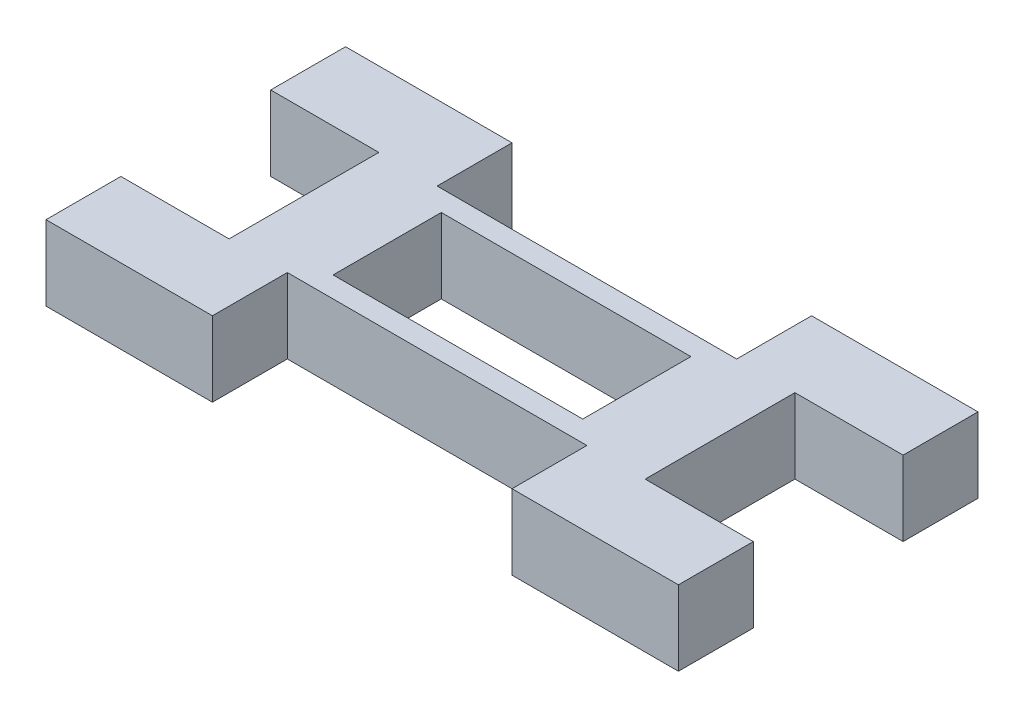
ISO-10303-21;
HEADER;
FILE_DESCRIPTION(('STEP AP214'),'2;1');
FILE_NAME('part.step','',(''),(''),'','','');
FILE_SCHEMA(('AUTOMOTIVE_DESIGN { 1 0 10303 214 1 1 1 1 }'));
ENDSEC;
DATA;
#1=APPLICATION_CONTEXT('core data for automotive mechanical design processes');
#2=APPLICATION_PROTOCOL_DEFINITION('international standard','automotive_design',2000,#1);
#3=PRODUCT_CONTEXT('',#1,'mechanical');
#4=PRODUCT('Part','Part','',(#3));
#5=PRODUCT_RELATED_PRODUCT_CATEGORY('part','',(#4));
#6=PRODUCT_DEFINITION_FORMATION('','',#4);
#7=PRODUCT_DEFINITION_CONTEXT('part definition',#1,'design');
#8=PRODUCT_DEFINITION('design','',#6,#7);
#9=PRODUCT_DEFINITION_SHAPE('','',#8);
#10=(LENGTH_UNIT() NAMED_UNIT(*) SI_UNIT(.MILLI.,.METRE.));
#11=(NAMED_UNIT(*) PLANE_ANGLE_UNIT() SI_UNIT($,.RADIAN.));
#12=(NAMED_UNIT(*) SI_UNIT($,.STERADIAN.) SOLID_ANGLE_UNIT());
#13=UNCERTAINTY_MEASURE_WITH_UNIT(LENGTH_MEASURE(1.E-05),#10,'distance_accuracy_value','');
#14=(GEOMETRIC_REPRESENTATION_CONTEXT(3) GLOBAL_UNCERTAINTY_ASSIGNED_CONTEXT((#13)) GLOBAL_UNIT_ASSIGNED_CONTEXT((#10,
#11,#12)) REPRESENTATION_CONTEXT('',''));
#15=CARTESIAN_POINT('',(0.,0.,0.));
#16=DIRECTION('',(0.,0.,1.));
#17=DIRECTION('',(1.,0.,0.));
#18=AXIS2_PLACEMENT_3D('',#15,#16,#17);
#19=CARTESIAN_POINT('',(-27.5,4.5,-4.5));
#20=DIRECTION('',(0.,0.,1.));
#21=DIRECTION('',(1.,0.,0.));
#22=AXIS2_PLACEMENT_3D('',#19,#20,#21);
#23=PLANE('',#22);
#24=DIRECTION('',(-1.,0.,0.));
#25=VECTOR('',#24,1.);
#26=CARTESIAN_POINT('',(-27.5,0.,-4.5));
#27=LINE('',#26,#25);
#28=CARTESIAN_POINT('',(9.00000000000002,0.,-4.5));
#29=VERTEX_POINT('',#28);
#30=CARTESIAN_POINT('',(-9.00000000000002,0.,-4.5));
#31=VERTEX_POINT('',#30);
#32=EDGE_CURVE('E360',#29,#31,#27,.T.);
#33=ORIENTED_EDGE('',*,*,#32,.T.);
#34=DIRECTION('',(0.,1.,0.));
#35=VECTOR('',#34,1.);
#36=CARTESIAN_POINT('',(-9.00000000000002,0.,-4.5));
#37=LINE('',#36,#35);
#38=CARTESIAN_POINT('',(-9.00000000000002,4.5,-4.5));
#39=VERTEX_POINT('',#38);
#40=EDGE_CURVE('E281',#31,#39,#37,.T.);
#41=ORIENTED_EDGE('',*,*,#40,.T.);
#42=DIRECTION('',(-1.,0.,0.));
#43=VECTOR('',#42,1.);
#44=CARTESIAN_POINT('',(-27.5,4.5,-4.5));
#45=LINE('',#44,#43);
#46=CARTESIAN_POINT('',(9.00000000000002,4.5,-4.5));
#47=VERTEX_POINT('',#46);
#48=EDGE_CURVE('E381',#47,#39,#45,.T.);
#49=ORIENTED_EDGE('',*,*,#48,.F.);
#50=DIRECTION('',(0.,1.,0.));
#51=VECTOR('',#50,1.);
#52=CARTESIAN_POINT('',(9.00000000000002,0.,-4.5));
#53=LINE('',#52,#51);
#54=EDGE_CURVE('E304',#29,#47,#53,.T.);
#55=ORIENTED_EDGE('',*,*,#54,.F.);
#56=EDGE_LOOP('',(#33,#41,#49,#55));
#57=FACE_BOUND('',#56,.T.);
#58=ADVANCED_FACE('F33',(#57),#23,.F.);
#59=CARTESIAN_POINT('',(-27.5,4.5,4.5));
#60=DIRECTION('',(0.,0.,-1.));
#61=DIRECTION('',(-1.,0.,0.));
#62=AXIS2_PLACEMENT_3D('',#59,#60,#61);
#63=PLANE('',#62);
#64=DIRECTION('',(1.,0.,0.));
#65=VECTOR('',#64,1.);
#66=CARTESIAN_POINT('',(-27.5,0.,4.5));
#67=LINE('',#66,#65);
#68=CARTESIAN_POINT('',(-9.00000000000002,0.,4.5));
#69=VERTEX_POINT('',#68);
#70=CARTESIAN_POINT('',(9.00000000000003,0.,4.5));
#71=VERTEX_POINT('',#70);
#72=EDGE_CURVE('E366',#69,#71,#67,.T.);
#73=ORIENTED_EDGE('',*,*,#72,.T.);
#74=DIRECTION('',(0.,1.,0.));
#75=VECTOR('',#74,1.);
#76=CARTESIAN_POINT('',(9.00000000000002,0.,4.5));
#77=LINE('',#76,#75);
#78=CARTESIAN_POINT('',(9.00000000000003,4.5,4.5));
#79=VERTEX_POINT('',#78);
#80=EDGE_CURVE('E405',#71,#79,#77,.T.);
#81=ORIENTED_EDGE('',*,*,#80,.T.);
#82=DIRECTION('',(1.,0.,0.));
#83=VECTOR('',#82,1.);
#84=CARTESIAN_POINT('',(-27.5,4.5,4.5));
#85=LINE('',#84,#83);
#86=CARTESIAN_POINT('',(-9.00000000000002,4.5,4.5));
#87=VERTEX_POINT('',#86);
#88=EDGE_CURVE('E321',#87,#79,#85,.T.);
#89=ORIENTED_EDGE('',*,*,#88,.F.);
#90=DIRECTION('',(0.,1.,0.));
#91=VECTOR('',#90,1.);
#92=CARTESIAN_POINT('',(-9.00000000000002,0.,4.5));
#93=LINE('',#92,#91);
#94=EDGE_CURVE('E367',#69,#87,#93,.T.);
#95=ORIENTED_EDGE('',*,*,#94,.F.);
#96=EDGE_LOOP('',(#73,#81,#89,#95));
#97=FACE_BOUND('',#96,.T.);
#98=ADVANCED_FACE('F352',(#97),#63,.F.);
#99=CARTESIAN_POINT('',(0.,4.5,0.));
#100=DIRECTION('',(0.,-1.,0.));
#101=DIRECTION('',(0.,0.,-1.));
#102=AXIS2_PLACEMENT_3D('',#99,#100,#101);
#103=PLANE('',#102);
#104=DIRECTION('',(1.,0.,0.));
#105=VECTOR('',#104,1.);
#106=CARTESIAN_POINT('',(0.,4.5,-3.25));
#107=LINE('',#106,#105);
#108=CARTESIAN_POINT('',(-7.49999999999993,4.5,-3.25));
#109=VERTEX_POINT('',#108);
#110=CARTESIAN_POINT('',(7.49999999999998,4.5,-3.25));
#111=VERTEX_POINT('',#110);
#112=EDGE_CURVE('E189',#109,#111,#107,.T.);
#113=ORIENTED_EDGE('',*,*,#112,.T.);
#114=DIRECTION('',(0.,0.,1.));
#115=VECTOR('',#114,1.);
#116=CARTESIAN_POINT('',(7.49999999999998,4.5,0.));
#117=LINE('',#116,#115);
#118=CARTESIAN_POINT('',(7.49999999999998,4.5,3.25));
#119=VERTEX_POINT('',#118);
#120=EDGE_CURVE('E211',#111,#119,#117,.T.);
#121=ORIENTED_EDGE('',*,*,#120,.T.);
#122=DIRECTION('',(-1.,0.,0.));
#123=VECTOR('',#122,1.);
#124=CARTESIAN_POINT('',(0.,4.5,3.25));
#125=LINE('',#124,#123);
#126=CARTESIAN_POINT('',(-7.49999999999993,4.5,3.25));
#127=VERTEX_POINT('',#126);
#128=EDGE_CURVE('E209',#119,#127,#125,.T.);
#129=ORIENTED_EDGE('',*,*,#128,.T.);
#130=DIRECTION('',(0.,0.,-1.));
#131=VECTOR('',#130,1.);
#132=CARTESIAN_POINT('',(-7.49999999999993,4.5,0.));
#133=LINE('',#132,#131);
#134=EDGE_CURVE('E194',#127,#109,#133,.T.);
#135=ORIENTED_EDGE('',*,*,#134,.T.);
#136=EDGE_LOOP('',(#113,#121,#129,#135));
#137=FACE_BOUND('',#136,.T.);
#138=DIRECTION('',(0.,0.,-1.));
#139=VECTOR('',#138,1.);
#140=CARTESIAN_POINT('',(19.,4.5,4.5));
#141=LINE('',#140,#139);
#142=CARTESIAN_POINT('',(19.,4.5,8.99999999999999));
#143=VERTEX_POINT('',#142);
#144=CARTESIAN_POINT('',(19.,4.5,4.5));
#145=VERTEX_POINT('',#144);
#146=EDGE_CURVE('E460',#143,#145,#141,.T.);
#147=ORIENTED_EDGE('',*,*,#146,.T.);
#148=DIRECTION('',(-1.,0.,0.));
#149=VECTOR('',#148,1.);
#150=CARTESIAN_POINT('',(0.,4.5,4.5));
#151=LINE('',#150,#149);
#152=CARTESIAN_POINT('',(12.5,4.5,4.5));
#153=VERTEX_POINT('',#152);
#154=EDGE_CURVE('E233',#145,#153,#151,.T.);
#155=ORIENTED_EDGE('',*,*,#154,.T.);
#156=DIRECTION('',(0.,0.,-1.));
#157=VECTOR('',#156,1.);
#158=CARTESIAN_POINT('',(12.5,4.5,0.));
#159=LINE('',#158,#157);
#160=CARTESIAN_POINT('',(12.5,4.5,-4.5));
#161=VERTEX_POINT('',#160);
#162=EDGE_CURVE('E236',#153,#161,#159,.T.);
#163=ORIENTED_EDGE('',*,*,#162,.T.);
#164=DIRECTION('',(1.,0.,0.));
#165=VECTOR('',#164,1.);
#166=CARTESIAN_POINT('',(0.,4.5,-4.5));
#167=LINE('',#166,#165);
#168=CARTESIAN_POINT('',(19.,4.5,-4.5));
#169=VERTEX_POINT('',#168);
#170=EDGE_CURVE('E228',#161,#169,#167,.T.);
#171=ORIENTED_EDGE('',*,*,#170,.T.);
#172=DIRECTION('',(0.,0.,-1.));
#173=VECTOR('',#172,1.);
#174=CARTESIAN_POINT('',(19.,4.5,-4.5));
#175=LINE('',#174,#173);
#176=CARTESIAN_POINT('',(19.,4.5,-8.99999999999999));
#177=VERTEX_POINT('',#176);
#178=EDGE_CURVE('E283',#169,#177,#175,.T.);
#179=ORIENTED_EDGE('',*,*,#178,.T.);
#180=DIRECTION('',(-1.,0.,0.));
#181=VECTOR('',#180,1.);
#182=CARTESIAN_POINT('',(19.,4.5,-8.99999999999999));
#183=LINE('',#182,#181);
#184=CARTESIAN_POINT('',(9.,4.5,-8.99999999999999));
#185=VERTEX_POINT('',#184);
#186=EDGE_CURVE('E295',#177,#185,#183,.T.);
#187=ORIENTED_EDGE('',*,*,#186,.T.);
#188=DIRECTION('',(0.,0.,1.));
#189=VECTOR('',#188,1.);
#190=CARTESIAN_POINT('',(9.,4.5,-8.99999999999999));
#191=LINE('',#190,#189);
#192=EDGE_CURVE('E298',#185,#47,#191,.T.);
#193=ORIENTED_EDGE('',*,*,#192,.T.);
#194=ORIENTED_EDGE('',*,*,#48,.T.);
#195=DIRECTION('',(0.,0.,-1.));
#196=VECTOR('',#195,1.);
#197=CARTESIAN_POINT('',(-9.,4.5,-8.99999999999999));
#198=LINE('',#197,#196);
#199=CARTESIAN_POINT('',(-9.,4.5,-8.99999999999999));
#200=VERTEX_POINT('',#199);
#201=EDGE_CURVE('E262',#39,#200,#198,.T.);
#202=ORIENTED_EDGE('',*,*,#201,.T.);
#203=DIRECTION('',(-1.,0.,0.));
#204=VECTOR('',#203,1.);
#205=CARTESIAN_POINT('',(-19.,4.5,-8.99999999999999));
#206=LINE('',#205,#204);
#207=CARTESIAN_POINT('',(-19.,4.5,-8.99999999999999));
#208=VERTEX_POINT('',#207);
#209=EDGE_CURVE('E276',#200,#208,#206,.T.);
#210=ORIENTED_EDGE('',*,*,#209,.T.);
#211=DIRECTION('',(0.,0.,1.));
#212=VECTOR('',#211,1.);
#213=CARTESIAN_POINT('',(-19.,4.5,-4.5));
#214=LINE('',#213,#212);
#215=CARTESIAN_POINT('',(-19.,4.5,-4.5));
#216=VERTEX_POINT('',#215);
#217=EDGE_CURVE('E267',#208,#216,#214,.T.);
#218=ORIENTED_EDGE('',*,*,#217,.T.);
#219=DIRECTION('',(1.,0.,0.));
#220=VECTOR('',#219,1.);
#221=CARTESIAN_POINT('',(0.,4.5,-4.5));
#222=LINE('',#221,#220);
#223=CARTESIAN_POINT('',(-12.5,4.5,-4.5));
#224=VERTEX_POINT('',#223);
#225=EDGE_CURVE('E247',#216,#224,#222,.T.);
#226=ORIENTED_EDGE('',*,*,#225,.T.);
#227=DIRECTION('',(0.,0.,1.));
#228=VECTOR('',#227,1.);
#229=CARTESIAN_POINT('',(-12.5,4.5,0.));
#230=LINE('',#229,#228);
#231=CARTESIAN_POINT('',(-12.5,4.5,4.5));
#232=VERTEX_POINT('',#231);
#233=EDGE_CURVE('E259',#224,#232,#230,.T.);
#234=ORIENTED_EDGE('',*,*,#233,.T.);
#235=DIRECTION('',(-1.,0.,0.));
#236=VECTOR('',#235,1.);
#237=CARTESIAN_POINT('',(0.,4.5,4.5));
#238=LINE('',#237,#236);
#239=CARTESIAN_POINT('',(-19.,4.5,4.5));
#240=VERTEX_POINT('',#239);
#241=EDGE_CURVE('E256',#232,#240,#238,.T.);
#242=ORIENTED_EDGE('',*,*,#241,.T.);
#243=DIRECTION('',(0.,0.,1.));
#244=VECTOR('',#243,1.);
#245=CARTESIAN_POINT('',(-19.,4.5,4.5));
#246=LINE('',#245,#244);
#247=CARTESIAN_POINT('',(-19.,4.5,9.));
#248=VERTEX_POINT('',#247);
#249=EDGE_CURVE('E401',#240,#248,#246,.T.);
#250=ORIENTED_EDGE('',*,*,#249,.T.);
#251=DIRECTION('',(1.,0.,0.));
#252=VECTOR('',#251,1.);
#253=CARTESIAN_POINT('',(-19.,4.5,9.));
#254=LINE('',#253,#252);
#255=CARTESIAN_POINT('',(-9.,4.5,9.));
#256=VERTEX_POINT('',#255);
#257=EDGE_CURVE('E404',#248,#256,#254,.T.);
#258=ORIENTED_EDGE('',*,*,#257,.T.);
#259=DIRECTION('',(0.,0.,-1.));
#260=VECTOR('',#259,1.);
#261=CARTESIAN_POINT('',(-9.,4.5,9.));
#262=LINE('',#261,#260);
#263=EDGE_CURVE('E416',#256,#87,#262,.T.);
#264=ORIENTED_EDGE('',*,*,#263,.T.);
#265=ORIENTED_EDGE('',*,*,#88,.T.);
#266=DIRECTION('',(0.,0.,1.));
#267=VECTOR('',#266,1.);
#268=CARTESIAN_POINT('',(9.,4.5,8.99999999999999));
#269=LINE('',#268,#267);
#270=CARTESIAN_POINT('',(9.,4.5,8.99999999999999));
#271=VERTEX_POINT('',#270);
#272=EDGE_CURVE('E307',#79,#271,#269,.T.);
#273=ORIENTED_EDGE('',*,*,#272,.T.);
#274=DIRECTION('',(1.,0.,0.));
#275=VECTOR('',#274,1.);
#276=CARTESIAN_POINT('',(19.,4.5,8.99999999999999));
#277=LINE('',#276,#275);
#278=EDGE_CURVE('E463',#271,#143,#277,.T.);
#279=ORIENTED_EDGE('',*,*,#278,.T.);
#280=EDGE_LOOP('',(#147,#155,#163,#171,#179,#187,#193,#194,#202,#210,#218,#226,#234,#242,#250,
#258,#264,#265,#273,#279));
#281=FACE_BOUND('',#280,.T.);
#282=ADVANCED_FACE('F207',(#137,#281),#103,.F.);
#283=CARTESIAN_POINT('',(0.,0.,0.));
#284=DIRECTION('',(0.,-1.,0.));
#285=DIRECTION('',(0.,0.,-1.));
#286=AXIS2_PLACEMENT_3D('',#283,#284,#285);
#287=PLANE('',#286);
#288=DIRECTION('',(0.,0.,1.));
#289=VECTOR('',#288,1.);
#290=CARTESIAN_POINT('',(7.49999999999998,0.,0.));
#291=LINE('',#290,#289);
#292=CARTESIAN_POINT('',(7.49999999999998,0.,-3.25));
#293=VERTEX_POINT('',#292);
#294=CARTESIAN_POINT('',(7.49999999999998,0.,3.25));
#295=VERTEX_POINT('',#294);
#296=EDGE_CURVE('E11',#293,#295,#291,.T.);
#297=ORIENTED_EDGE('',*,*,#296,.F.);
#298=DIRECTION('',(1.,0.,0.));
#299=VECTOR('',#298,1.);
#300=CARTESIAN_POINT('',(0.,0.,-3.25));
#301=LINE('',#300,#299);
#302=CARTESIAN_POINT('',(-7.49999999999993,0.,-3.25));
#303=VERTEX_POINT('',#302);
#304=EDGE_CURVE('E323',#303,#293,#301,.T.);
#305=ORIENTED_EDGE('',*,*,#304,.F.);
#306=DIRECTION('',(0.,0.,-1.));
#307=VECTOR('',#306,1.);
#308=CARTESIAN_POINT('',(-7.49999999999993,0.,0.));
#309=LINE('',#308,#307);
#310=CARTESIAN_POINT('',(-7.49999999999993,0.,3.25));
#311=VERTEX_POINT('',#310);
#312=EDGE_CURVE('E202',#311,#303,#309,.T.);
#313=ORIENTED_EDGE('',*,*,#312,.F.);
#314=DIRECTION('',(-1.,0.,0.));
#315=VECTOR('',#314,1.);
#316=CARTESIAN_POINT('',(0.,0.,3.25));
#317=LINE('',#316,#315);
#318=EDGE_CURVE('E40',#295,#311,#317,.T.);
#319=ORIENTED_EDGE('',*,*,#318,.F.);
#320=EDGE_LOOP('',(#297,#305,#313,#319));
#321=FACE_BOUND('',#320,.T.);
#322=DIRECTION('',(-1.,0.,0.));
#323=VECTOR('',#322,1.);
#324=CARTESIAN_POINT('',(0.,0.,4.5));
#325=LINE('',#324,#323);
#326=CARTESIAN_POINT('',(19.,0.,4.5));
#327=VERTEX_POINT('',#326);
#328=CARTESIAN_POINT('',(12.5,0.,4.5));
#329=VERTEX_POINT('',#328);
#330=EDGE_CURVE('E231',#327,#329,#325,.T.);
#331=ORIENTED_EDGE('',*,*,#330,.F.);
#332=DIRECTION('',(0.,0.,-1.));
#333=VECTOR('',#332,1.);
#334=CARTESIAN_POINT('',(19.,0.,4.5));
#335=LINE('',#334,#333);
#336=CARTESIAN_POINT('',(19.,0.,8.99999999999999));
#337=VERTEX_POINT('',#336);
#338=EDGE_CURVE('E454',#337,#327,#335,.T.);
#339=ORIENTED_EDGE('',*,*,#338,.F.);
#340=DIRECTION('',(1.,0.,0.));
#341=VECTOR('',#340,1.);
#342=CARTESIAN_POINT('',(19.,0.,8.99999999999999));
#343=LINE('',#342,#341);
#344=CARTESIAN_POINT('',(9.,0.,8.99999999999999));
#345=VERTEX_POINT('',#344);
#346=EDGE_CURVE('E470',#345,#337,#343,.T.);
#347=ORIENTED_EDGE('',*,*,#346,.F.);
#348=DIRECTION('',(0.,0.,1.));
#349=VECTOR('',#348,1.);
#350=CARTESIAN_POINT('',(9.,0.,8.99999999999999));
#351=LINE('',#350,#349);
#352=EDGE_CURVE('E462',#71,#345,#351,.T.);
#353=ORIENTED_EDGE('',*,*,#352,.F.);
#354=ORIENTED_EDGE('',*,*,#72,.F.);
#355=DIRECTION('',(0.,0.,-1.));
#356=VECTOR('',#355,1.);
#357=CARTESIAN_POINT('',(-9.,0.,9.));
#358=LINE('',#357,#356);
#359=CARTESIAN_POINT('',(-9.,0.,9.));
#360=VERTEX_POINT('',#359);
#361=EDGE_CURVE('E411',#360,#69,#358,.T.);
#362=ORIENTED_EDGE('',*,*,#361,.F.);
#363=DIRECTION('',(1.,0.,0.));
#364=VECTOR('',#363,1.);
#365=CARTESIAN_POINT('',(-19.,0.,9.));
#366=LINE('',#365,#364);
#367=CARTESIAN_POINT('',(-19.,0.,9.));
#368=VERTEX_POINT('',#367);
#369=EDGE_CURVE('E415',#368,#360,#366,.T.);
#370=ORIENTED_EDGE('',*,*,#369,.F.);
#371=DIRECTION('',(0.,0.,1.));
#372=VECTOR('',#371,1.);
#373=CARTESIAN_POINT('',(-19.,0.,4.5));
#374=LINE('',#373,#372);
#375=CARTESIAN_POINT('',(-19.,0.,4.5));
#376=VERTEX_POINT('',#375);
#377=EDGE_CURVE('E412',#376,#368,#374,.T.);
#378=ORIENTED_EDGE('',*,*,#377,.F.);
#379=DIRECTION('',(-1.,0.,0.));
#380=VECTOR('',#379,1.);
#381=CARTESIAN_POINT('',(0.,0.,4.5));
#382=LINE('',#381,#380);
#383=CARTESIAN_POINT('',(-12.5,0.,4.5));
#384=VERTEX_POINT('',#383);
#385=EDGE_CURVE('E250',#384,#376,#382,.T.);
#386=ORIENTED_EDGE('',*,*,#385,.F.);
#387=DIRECTION('',(0.,0.,1.));
#388=VECTOR('',#387,1.);
#389=CARTESIAN_POINT('',(-12.5,0.,0.));
#390=LINE('',#389,#388);
#391=CARTESIAN_POINT('',(-12.5,0.,-4.5));
#392=VERTEX_POINT('',#391);
#393=EDGE_CURVE('E318',#392,#384,#390,.T.);
#394=ORIENTED_EDGE('',*,*,#393,.F.);
#395=DIRECTION('',(1.,0.,0.));
#396=VECTOR('',#395,1.);
#397=CARTESIAN_POINT('',(0.,0.,-4.5));
#398=LINE('',#397,#396);
#399=CARTESIAN_POINT('',(-19.,0.,-4.5));
#400=VERTEX_POINT('',#399);
#401=EDGE_CURVE('E243',#400,#392,#398,.T.);
#402=ORIENTED_EDGE('',*,*,#401,.F.);
#403=DIRECTION('',(0.,0.,1.));
#404=VECTOR('',#403,1.);
#405=CARTESIAN_POINT('',(-19.,0.,-4.5));
#406=LINE('',#405,#404);
#407=CARTESIAN_POINT('',(-19.,0.,-8.99999999999999));
#408=VERTEX_POINT('',#407);
#409=EDGE_CURVE('E270',#408,#400,#406,.T.);
#410=ORIENTED_EDGE('',*,*,#409,.F.);
#411=DIRECTION('',(-1.,0.,0.));
#412=VECTOR('',#411,1.);
#413=CARTESIAN_POINT('',(-19.,0.,-8.99999999999999));
#414=LINE('',#413,#412);
#415=CARTESIAN_POINT('',(-9.,0.,-8.99999999999999));
#416=VERTEX_POINT('',#415);
#417=EDGE_CURVE('E266',#416,#408,#414,.T.);
#418=ORIENTED_EDGE('',*,*,#417,.F.);
#419=DIRECTION('',(0.,0.,-1.));
#420=VECTOR('',#419,1.);
#421=CARTESIAN_POINT('',(-9.,0.,-8.99999999999999));
#422=LINE('',#421,#420);
#423=EDGE_CURVE('E263',#31,#416,#422,.T.);
#424=ORIENTED_EDGE('',*,*,#423,.F.);
#425=ORIENTED_EDGE('',*,*,#32,.F.);
#426=DIRECTION('',(0.,0.,1.));
#427=VECTOR('',#426,1.);
#428=CARTESIAN_POINT('',(9.,0.,-8.99999999999999));
#429=LINE('',#428,#427);
#430=CARTESIAN_POINT('',(9.,0.,-8.99999999999999));
#431=VERTEX_POINT('',#430);
#432=EDGE_CURVE('E293',#431,#29,#429,.T.);
#433=ORIENTED_EDGE('',*,*,#432,.F.);
#434=DIRECTION('',(-1.,0.,0.));
#435=VECTOR('',#434,1.);
#436=CARTESIAN_POINT('',(19.,0.,-8.99999999999999));
#437=LINE('',#436,#435);
#438=CARTESIAN_POINT('',(19.,0.,-8.99999999999999));
#439=VERTEX_POINT('',#438);
#440=EDGE_CURVE('E290',#439,#431,#437,.T.);
#441=ORIENTED_EDGE('',*,*,#440,.F.);
#442=DIRECTION('',(0.,0.,-1.));
#443=VECTOR('',#442,1.);
#444=CARTESIAN_POINT('',(19.,0.,-4.5));
#445=LINE('',#444,#443);
#446=CARTESIAN_POINT('',(19.,0.,-4.5));
#447=VERTEX_POINT('',#446);
#448=EDGE_CURVE('E294',#447,#439,#445,.T.);
#449=ORIENTED_EDGE('',*,*,#448,.F.);
#450=DIRECTION('',(1.,0.,0.));
#451=VECTOR('',#450,1.);
#452=CARTESIAN_POINT('',(0.,0.,-4.5));
#453=LINE('',#452,#451);
#454=CARTESIAN_POINT('',(12.5,0.,-4.5));
#455=VERTEX_POINT('',#454);
#456=EDGE_CURVE('E220',#455,#447,#453,.T.);
#457=ORIENTED_EDGE('',*,*,#456,.F.);
#458=DIRECTION('',(0.,0.,-1.));
#459=VECTOR('',#458,1.);
#460=CARTESIAN_POINT('',(12.5,0.,0.));
#461=LINE('',#460,#459);
#462=EDGE_CURVE('E320',#329,#455,#461,.T.);
#463=ORIENTED_EDGE('',*,*,#462,.F.);
#464=EDGE_LOOP('',(#331,#339,#347,#353,#354,#362,#370,#378,#386,#394,#402,#410,#418,#424,#425,
#433,#441,#449,#457,#463));
#465=FACE_BOUND('',#464,.T.);
#466=ADVANCED_FACE('F333',(#321,#465),#287,.T.);
#467=CARTESIAN_POINT('',(-9.,0.,9.));
#468=DIRECTION('',(1.,0.,0.));
#469=DIRECTION('',(0.,0.,-1.));
#470=AXIS2_PLACEMENT_3D('',#467,#468,#469);
#471=PLANE('',#470);
#472=ORIENTED_EDGE('',*,*,#263,.F.);
#473=DIRECTION('',(0.,1.,0.));
#474=VECTOR('',#473,1.);
#475=CARTESIAN_POINT('',(-9.,0.,9.));
#476=LINE('',#475,#474);
#477=EDGE_CURVE('E421',#360,#256,#476,.T.);
#478=ORIENTED_EDGE('',*,*,#477,.F.);
#479=ORIENTED_EDGE('',*,*,#361,.T.);
#480=ORIENTED_EDGE('',*,*,#94,.T.);
#481=EDGE_LOOP('',(#472,#478,#479,#480));
#482=FACE_BOUND('',#481,.T.);
#483=ADVANCED_FACE('F516',(#482),#471,.T.);
#484=CARTESIAN_POINT('',(-19.,0.,9.));
#485=DIRECTION('',(0.,0.,1.));
#486=DIRECTION('',(1.,0.,0.));
#487=AXIS2_PLACEMENT_3D('',#484,#485,#486);
#488=PLANE('',#487);
#489=ORIENTED_EDGE('',*,*,#257,.F.);
#490=DIRECTION('',(0.,1.,0.));
#491=VECTOR('',#490,1.);
#492=CARTESIAN_POINT('',(-19.,0.,9.));
#493=LINE('',#492,#491);
#494=EDGE_CURVE('E410',#368,#248,#493,.T.);
#495=ORIENTED_EDGE('',*,*,#494,.F.);
#496=ORIENTED_EDGE('',*,*,#369,.T.);
#497=ORIENTED_EDGE('',*,*,#477,.T.);
#498=EDGE_LOOP('',(#489,#495,#496,#497));
#499=FACE_BOUND('',#498,.T.);
#500=ADVANCED_FACE('F437',(#499),#488,.T.);
#501=CARTESIAN_POINT('',(-19.,0.,4.5));
#502=DIRECTION('',(-1.,0.,0.));
#503=DIRECTION('',(0.,0.,1.));
#504=AXIS2_PLACEMENT_3D('',#501,#502,#503);
#505=PLANE('',#504);
#506=ORIENTED_EDGE('',*,*,#249,.F.);
#507=DIRECTION('',(0.,1.,0.));
#508=VECTOR('',#507,1.);
#509=CARTESIAN_POINT('',(-19.,0.,4.5));
#510=LINE('',#509,#508);
#511=EDGE_CURVE('E408',#376,#240,#510,.T.);
#512=ORIENTED_EDGE('',*,*,#511,.F.);
#513=ORIENTED_EDGE('',*,*,#377,.T.);
#514=ORIENTED_EDGE('',*,*,#494,.T.);
#515=EDGE_LOOP('',(#506,#512,#513,#514));
#516=FACE_BOUND('',#515,.T.);
#517=ADVANCED_FACE('F430',(#516),#505,.T.);
#518=CARTESIAN_POINT('',(9.,0.,8.99999999999999));
#519=DIRECTION('',(-1.,0.,0.));
#520=DIRECTION('',(0.,0.,1.));
#521=AXIS2_PLACEMENT_3D('',#518,#519,#520);
#522=PLANE('',#521);
#523=ORIENTED_EDGE('',*,*,#272,.F.);
#524=ORIENTED_EDGE('',*,*,#80,.F.);
#525=ORIENTED_EDGE('',*,*,#352,.T.);
#526=DIRECTION('',(0.,1.,0.));
#527=VECTOR('',#526,1.);
#528=CARTESIAN_POINT('',(9.,0.,8.99999999999999));
#529=LINE('',#528,#527);
#530=EDGE_CURVE('E451',#345,#271,#529,.T.);
#531=ORIENTED_EDGE('',*,*,#530,.T.);
#532=EDGE_LOOP('',(#523,#524,#525,#531));
#533=FACE_BOUND('',#532,.T.);
#534=ADVANCED_FACE('F509',(#533),#522,.T.);
#535=CARTESIAN_POINT('',(19.,0.,4.5));
#536=DIRECTION('',(1.,0.,0.));
#537=DIRECTION('',(0.,0.,-1.));
#538=AXIS2_PLACEMENT_3D('',#535,#536,#537);
#539=PLANE('',#538);
#540=ORIENTED_EDGE('',*,*,#146,.F.);
#541=DIRECTION('',(0.,1.,0.));
#542=VECTOR('',#541,1.);
#543=CARTESIAN_POINT('',(19.,0.,8.99999999999999));
#544=LINE('',#543,#542);
#545=EDGE_CURVE('E453',#337,#143,#544,.T.);
#546=ORIENTED_EDGE('',*,*,#545,.F.);
#547=ORIENTED_EDGE('',*,*,#338,.T.);
#548=DIRECTION('',(0.,1.,0.));
#549=VECTOR('',#548,1.);
#550=CARTESIAN_POINT('',(19.,0.,4.5));
#551=LINE('',#550,#549);
#552=EDGE_CURVE('E456',#327,#145,#551,.T.);
#553=ORIENTED_EDGE('',*,*,#552,.T.);
#554=EDGE_LOOP('',(#540,#546,#547,#553));
#555=FACE_BOUND('',#554,.T.);
#556=ADVANCED_FACE('F501',(#555),#539,.T.);
#557=CARTESIAN_POINT('',(19.,0.,8.99999999999999));
#558=DIRECTION('',(0.,0.,1.));
#559=DIRECTION('',(1.,0.,0.));
#560=AXIS2_PLACEMENT_3D('',#557,#558,#559);
#561=PLANE('',#560);
#562=ORIENTED_EDGE('',*,*,#278,.F.);
#563=ORIENTED_EDGE('',*,*,#530,.F.);
#564=ORIENTED_EDGE('',*,*,#346,.T.);
#565=ORIENTED_EDGE('',*,*,#545,.T.);
#566=EDGE_LOOP('',(#562,#563,#564,#565));
#567=FACE_BOUND('',#566,.T.);
#568=ADVANCED_FACE('F504',(#567),#561,.T.);
#569=CARTESIAN_POINT('',(9.,0.,-8.99999999999999));
#570=DIRECTION('',(-1.,0.,0.));
#571=DIRECTION('',(0.,0.,1.));
#572=AXIS2_PLACEMENT_3D('',#569,#570,#571);
#573=PLANE('',#572);
#574=ORIENTED_EDGE('',*,*,#192,.F.);
#575=DIRECTION('',(0.,1.,0.));
#576=VECTOR('',#575,1.);
#577=CARTESIAN_POINT('',(9.,0.,-8.99999999999999));
#578=LINE('',#577,#576);
#579=EDGE_CURVE('E301',#431,#185,#578,.T.);
#580=ORIENTED_EDGE('',*,*,#579,.F.);
#581=ORIENTED_EDGE('',*,*,#432,.T.);
#582=ORIENTED_EDGE('',*,*,#54,.T.);
#583=EDGE_LOOP('',(#574,#580,#581,#582));
#584=FACE_BOUND('',#583,.T.);
#585=ADVANCED_FACE('F664',(#584),#573,.T.);
#586=CARTESIAN_POINT('',(19.,0.,-8.99999999999999));
#587=DIRECTION('',(0.,0.,-1.));
#588=DIRECTION('',(-1.,0.,0.));
#589=AXIS2_PLACEMENT_3D('',#586,#587,#588);
#590=PLANE('',#589);
#591=ORIENTED_EDGE('',*,*,#186,.F.);
#592=DIRECTION('',(0.,1.,0.));
#593=VECTOR('',#592,1.);
#594=CARTESIAN_POINT('',(19.,0.,-8.99999999999999));
#595=LINE('',#594,#593);
#596=EDGE_CURVE('E476',#439,#177,#595,.T.);
#597=ORIENTED_EDGE('',*,*,#596,.F.);
#598=ORIENTED_EDGE('',*,*,#440,.T.);
#599=ORIENTED_EDGE('',*,*,#579,.T.);
#600=EDGE_LOOP('',(#591,#597,#598,#599));
#601=FACE_BOUND('',#600,.T.);
#602=ADVANCED_FACE('F490',(#601),#590,.T.);
#603=CARTESIAN_POINT('',(19.,0.,-4.5));
#604=DIRECTION('',(1.,0.,0.));
#605=DIRECTION('',(0.,0.,-1.));
#606=AXIS2_PLACEMENT_3D('',#603,#604,#605);
#607=PLANE('',#606);
#608=ORIENTED_EDGE('',*,*,#178,.F.);
#609=DIRECTION('',(0.,1.,0.));
#610=VECTOR('',#609,1.);
#611=CARTESIAN_POINT('',(19.,0.,-4.5));
#612=LINE('',#611,#610);
#613=EDGE_CURVE('E311',#447,#169,#612,.T.);
#614=ORIENTED_EDGE('',*,*,#613,.F.);
#615=ORIENTED_EDGE('',*,*,#448,.T.);
#616=ORIENTED_EDGE('',*,*,#596,.T.);
#617=EDGE_LOOP('',(#608,#614,#615,#616));
#618=FACE_BOUND('',#617,.T.);
#619=ADVANCED_FACE('F484',(#618),#607,.T.);
#620=CARTESIAN_POINT('',(-9.,0.,-8.99999999999999));
#621=DIRECTION('',(1.,0.,0.));
#622=DIRECTION('',(0.,0.,-1.));
#623=AXIS2_PLACEMENT_3D('',#620,#621,#622);
#624=PLANE('',#623);
#625=ORIENTED_EDGE('',*,*,#201,.F.);
#626=ORIENTED_EDGE('',*,*,#40,.F.);
#627=ORIENTED_EDGE('',*,*,#423,.T.);
#628=DIRECTION('',(0.,1.,0.));
#629=VECTOR('',#628,1.);
#630=CARTESIAN_POINT('',(-9.,0.,-8.99999999999999));
#631=LINE('',#630,#629);
#632=EDGE_CURVE('E273',#416,#200,#631,.T.);
#633=ORIENTED_EDGE('',*,*,#632,.T.);
#634=EDGE_LOOP('',(#625,#626,#627,#633));
#635=FACE_BOUND('',#634,.T.);
#636=ADVANCED_FACE('F371',(#635),#624,.T.);
#637=CARTESIAN_POINT('',(-19.,0.,-4.5));
#638=DIRECTION('',(-1.,0.,0.));
#639=DIRECTION('',(0.,0.,1.));
#640=AXIS2_PLACEMENT_3D('',#637,#638,#639);
#641=PLANE('',#640);
#642=ORIENTED_EDGE('',*,*,#217,.F.);
#643=DIRECTION('',(0.,1.,0.));
#644=VECTOR('',#643,1.);
#645=CARTESIAN_POINT('',(-19.,0.,-8.99999999999999));
#646=LINE('',#645,#644);
#647=EDGE_CURVE('E287',#408,#208,#646,.T.);
#648=ORIENTED_EDGE('',*,*,#647,.F.);
#649=ORIENTED_EDGE('',*,*,#409,.T.);
#650=DIRECTION('',(0.,1.,0.));
#651=VECTOR('',#650,1.);
#652=CARTESIAN_POINT('',(-19.,0.,-4.5));
#653=LINE('',#652,#651);
#654=EDGE_CURVE('E284',#400,#216,#653,.T.);
#655=ORIENTED_EDGE('',*,*,#654,.T.);
#656=EDGE_LOOP('',(#642,#648,#649,#655));
#657=FACE_BOUND('',#656,.T.);
#658=ADVANCED_FACE('F578',(#657),#641,.T.);
#659=CARTESIAN_POINT('',(-19.,0.,-8.99999999999999));
#660=DIRECTION('',(0.,0.,-1.));
#661=DIRECTION('',(-1.,0.,0.));
#662=AXIS2_PLACEMENT_3D('',#659,#660,#661);
#663=PLANE('',#662);
#664=ORIENTED_EDGE('',*,*,#209,.F.);
#665=ORIENTED_EDGE('',*,*,#632,.F.);
#666=ORIENTED_EDGE('',*,*,#417,.T.);
#667=ORIENTED_EDGE('',*,*,#647,.T.);
#668=EDGE_LOOP('',(#664,#665,#666,#667));
#669=FACE_BOUND('',#668,.T.);
#670=ADVANCED_FACE('F378',(#669),#663,.T.);
#671=CARTESIAN_POINT('',(-12.5,-4.99999999997031E-05,-4.5));
#672=DIRECTION('',(1.,0.,0.));
#673=DIRECTION('',(0.,0.,-1.));
#674=AXIS2_PLACEMENT_3D('',#671,#672,#673);
#675=PLANE('',#674);
#676=DIRECTION('',(0.,1.,0.));
#677=VECTOR('',#676,1.);
#678=CARTESIAN_POINT('',(-12.5,-4.99999999997031E-05,-4.5));
#679=LINE('',#678,#677);
#680=EDGE_CURVE('E239',#392,#224,#679,.T.);
#681=ORIENTED_EDGE('',*,*,#680,.F.);
#682=ORIENTED_EDGE('',*,*,#393,.T.);
#683=DIRECTION('',(0.,1.,0.));
#684=VECTOR('',#683,1.);
#685=CARTESIAN_POINT('',(-12.5,-4.99999999997031E-05,4.5));
#686=LINE('',#685,#684);
#687=EDGE_CURVE('E240',#384,#232,#686,.T.);
#688=ORIENTED_EDGE('',*,*,#687,.T.);
#689=ORIENTED_EDGE('',*,*,#233,.F.);
#690=EDGE_LOOP('',(#681,#682,#688,#689));
#691=FACE_BOUND('',#690,.T.);
#692=ADVANCED_FACE('F446',(#691),#675,.F.);
#693=CARTESIAN_POINT('',(-42.5,-4.99999999997031E-05,4.5));
#694=DIRECTION('',(0.,0.,1.));
#695=DIRECTION('',(1.,0.,0.));
#696=AXIS2_PLACEMENT_3D('',#693,#694,#695);
#697=PLANE('',#696);
#698=ORIENTED_EDGE('',*,*,#687,.F.);
#699=ORIENTED_EDGE('',*,*,#385,.T.);
#700=ORIENTED_EDGE('',*,*,#511,.T.);
#701=ORIENTED_EDGE('',*,*,#241,.F.);
#702=EDGE_LOOP('',(#698,#699,#700,#701));
#703=FACE_BOUND('',#702,.T.);
#704=ADVANCED_FACE('F442',(#703),#697,.F.);
#705=CARTESIAN_POINT('',(-42.5,-4.99999999997031E-05,-4.5));
#706=DIRECTION('',(0.,0.,-1.));
#707=DIRECTION('',(-1.,0.,0.));
#708=AXIS2_PLACEMENT_3D('',#705,#706,#707);
#709=PLANE('',#708);
#710=ORIENTED_EDGE('',*,*,#654,.F.);
#711=ORIENTED_EDGE('',*,*,#401,.T.);
#712=ORIENTED_EDGE('',*,*,#680,.T.);
#713=ORIENTED_EDGE('',*,*,#225,.F.);
#714=EDGE_LOOP('',(#710,#711,#712,#713));
#715=FACE_BOUND('',#714,.T.);
#716=ADVANCED_FACE('F602',(#715),#709,.F.);
#717=CARTESIAN_POINT('',(12.5,-4.99999999997031E-05,-4.5));
#718=DIRECTION('',(-1.,0.,0.));
#719=DIRECTION('',(0.,0.,1.));
#720=AXIS2_PLACEMENT_3D('',#717,#718,#719);
#721=PLANE('',#720);
#722=DIRECTION('',(0.,1.,0.));
#723=VECTOR('',#722,1.);
#724=CARTESIAN_POINT('',(12.5,-4.99999999997031E-05,4.5));
#725=LINE('',#724,#723);
#726=EDGE_CURVE('E217',#329,#153,#725,.T.);
#727=ORIENTED_EDGE('',*,*,#726,.F.);
#728=ORIENTED_EDGE('',*,*,#462,.T.);
#729=DIRECTION('',(0.,1.,0.));
#730=VECTOR('',#729,1.);
#731=CARTESIAN_POINT('',(12.5,-4.99999999997031E-05,-4.5));
#732=LINE('',#731,#730);
#733=EDGE_CURVE('E216',#455,#161,#732,.T.);
#734=ORIENTED_EDGE('',*,*,#733,.T.);
#735=ORIENTED_EDGE('',*,*,#162,.F.);
#736=EDGE_LOOP('',(#727,#728,#734,#735));
#737=FACE_BOUND('',#736,.T.);
#738=ADVANCED_FACE('F495',(#737),#721,.F.);
#739=CARTESIAN_POINT('',(42.5,-4.99999999997031E-05,4.5));
#740=DIRECTION('',(0.,0.,1.));
#741=DIRECTION('',(1.,0.,0.));
#742=AXIS2_PLACEMENT_3D('',#739,#740,#741);
#743=PLANE('',#742);
#744=ORIENTED_EDGE('',*,*,#552,.F.);
#745=ORIENTED_EDGE('',*,*,#330,.T.);
#746=ORIENTED_EDGE('',*,*,#726,.T.);
#747=ORIENTED_EDGE('',*,*,#154,.F.);
#748=EDGE_LOOP('',(#744,#745,#746,#747));
#749=FACE_BOUND('',#748,.T.);
#750=ADVANCED_FACE('F346',(#749),#743,.F.);
#751=CARTESIAN_POINT('',(42.5,-4.99999999997031E-05,-4.5));
#752=DIRECTION('',(0.,0.,-1.));
#753=DIRECTION('',(-1.,0.,0.));
#754=AXIS2_PLACEMENT_3D('',#751,#752,#753);
#755=PLANE('',#754);
#756=ORIENTED_EDGE('',*,*,#733,.F.);
#757=ORIENTED_EDGE('',*,*,#456,.T.);
#758=ORIENTED_EDGE('',*,*,#613,.T.);
#759=ORIENTED_EDGE('',*,*,#170,.F.);
#760=EDGE_LOOP('',(#756,#757,#758,#759));
#761=FACE_BOUND('',#760,.T.);
#762=ADVANCED_FACE('F339',(#761),#755,.F.);
#763=CARTESIAN_POINT('',(7.49999999999998,-4.99999999997031E-05,3.25));
#764=DIRECTION('',(1.,0.,0.));
#765=DIRECTION('',(0.,0.,-1.));
#766=AXIS2_PLACEMENT_3D('',#763,#764,#765);
#767=PLANE('',#766);
#768=DIRECTION('',(0.,1.,0.));
#769=VECTOR('',#768,1.);
#770=CARTESIAN_POINT('',(7.49999999999998,-4.99999999997031E-05,-3.25));
#771=LINE('',#770,#769);
#772=EDGE_CURVE('E47',#293,#111,#771,.T.);
#773=ORIENTED_EDGE('',*,*,#772,.F.);
#774=ORIENTED_EDGE('',*,*,#296,.T.);
#775=DIRECTION('',(0.,1.,0.));
#776=VECTOR('',#775,1.);
#777=CARTESIAN_POINT('',(7.49999999999998,-4.99999999997031E-05,3.25));
#778=LINE('',#777,#776);
#779=EDGE_CURVE('E195',#295,#119,#778,.T.);
#780=ORIENTED_EDGE('',*,*,#779,.T.);
#781=ORIENTED_EDGE('',*,*,#120,.F.);
#782=EDGE_LOOP('',(#773,#774,#780,#781));
#783=FACE_BOUND('',#782,.T.);
#784=ADVANCED_FACE('F336',(#783),#767,.F.);
#785=CARTESIAN_POINT('',(-7.49999999999993,-4.99999999997031E-05,3.25));
#786=DIRECTION('',(0.,0.,1.));
#787=DIRECTION('',(1.,0.,0.));
#788=AXIS2_PLACEMENT_3D('',#785,#786,#787);
#789=PLANE('',#788);
#790=ORIENTED_EDGE('',*,*,#779,.F.);
#791=ORIENTED_EDGE('',*,*,#318,.T.);
#792=DIRECTION('',(0.,1.,0.));
#793=VECTOR('',#792,1.);
#794=CARTESIAN_POINT('',(-7.49999999999993,-4.99999999997031E-05,3.25));
#795=LINE('',#794,#793);
#796=EDGE_CURVE('E204',#311,#127,#795,.T.);
#797=ORIENTED_EDGE('',*,*,#796,.T.);
#798=ORIENTED_EDGE('',*,*,#128,.F.);
#799=EDGE_LOOP('',(#790,#791,#797,#798));
#800=FACE_BOUND('',#799,.T.);
#801=ADVANCED_FACE('F328',(#800),#789,.F.);
#802=CARTESIAN_POINT('',(-7.49999999999993,-4.99999999997031E-05,3.25));
#803=DIRECTION('',(-1.,0.,0.));
#804=DIRECTION('',(0.,0.,1.));
#805=AXIS2_PLACEMENT_3D('',#802,#803,#804);
#806=PLANE('',#805);
#807=ORIENTED_EDGE('',*,*,#796,.F.);
#808=ORIENTED_EDGE('',*,*,#312,.T.);
#809=DIRECTION('',(0.,1.,0.));
#810=VECTOR('',#809,1.);
#811=CARTESIAN_POINT('',(-7.49999999999993,-4.99999999997031E-05,-3.25));
#812=LINE('',#811,#810);
#813=EDGE_CURVE('E52',#303,#109,#812,.T.);
#814=ORIENTED_EDGE('',*,*,#813,.T.);
#815=ORIENTED_EDGE('',*,*,#134,.F.);
#816=EDGE_LOOP('',(#807,#808,#814,#815));
#817=FACE_BOUND('',#816,.T.);
#818=ADVANCED_FACE('F199',(#817),#806,.F.);
#819=CARTESIAN_POINT('',(-7.49999999999993,-4.99999999997031E-05,-3.25));
#820=DIRECTION('',(0.,0.,-1.));
#821=DIRECTION('',(-1.,0.,0.));
#822=AXIS2_PLACEMENT_3D('',#819,#820,#821);
#823=PLANE('',#822);
#824=ORIENTED_EDGE('',*,*,#813,.F.);
#825=ORIENTED_EDGE('',*,*,#304,.T.);
#826=ORIENTED_EDGE('',*,*,#772,.T.);
#827=ORIENTED_EDGE('',*,*,#112,.F.);
#828=EDGE_LOOP('',(#824,#825,#826,#827));
#829=FACE_BOUND('',#828,.T.);
#830=ADVANCED_FACE('F190',(#829),#823,.F.);
#831=CLOSED_SHELL('',(#58,#98,#282,#466,#483,#500,#517,#534,#556,#568,#585,#602,#619,#636,#658,
#670,#692,#704,#716,#738,#750,#762,#784,#801,#818,#830));
#832=MANIFOLD_SOLID_BREP('B2',#831);
#833=ADVANCED_BREP_SHAPE_REPRESENTATION('',(#18,#832),#14);
#834=SHAPE_DEFINITION_REPRESENTATION(#9,#833);
ENDSEC;
END-ISO-10303-21;
